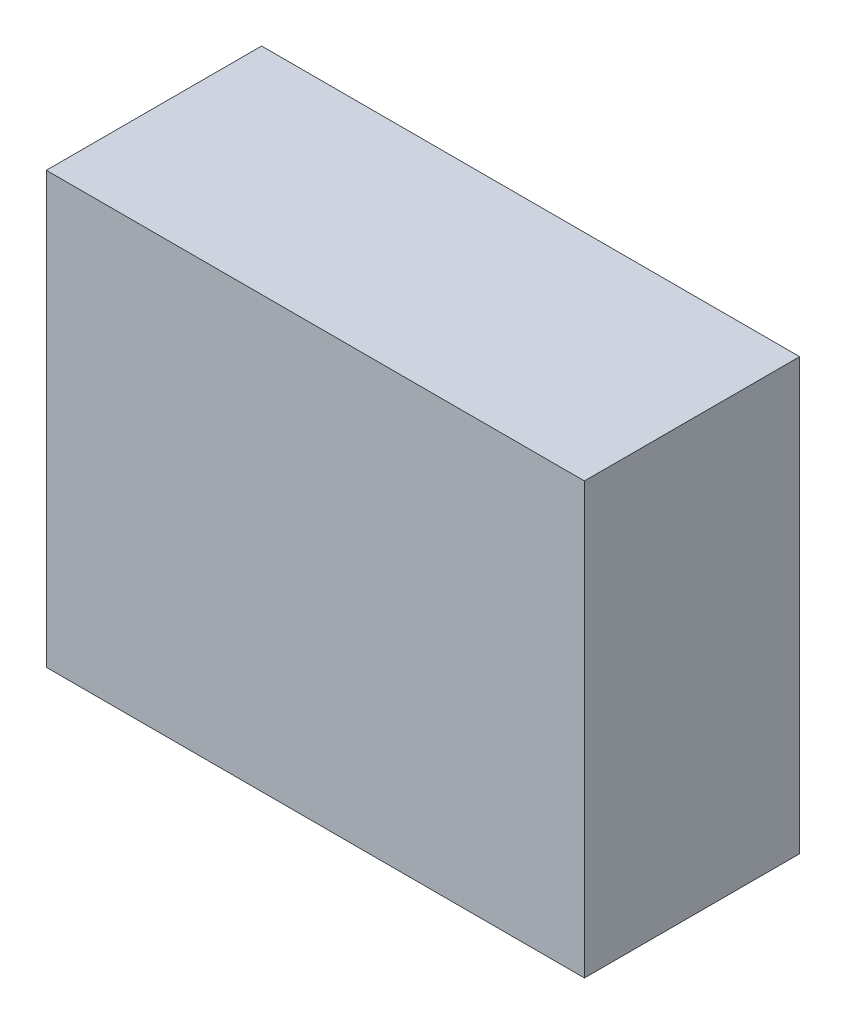
ISO-10303-21;
HEADER;
FILE_DESCRIPTION(('STEP AP214'),'2;1');
FILE_NAME('part.step','',(''),(''),'','','');
FILE_SCHEMA(('AUTOMOTIVE_DESIGN { 1 0 10303 214 1 1 1 1 }'));
ENDSEC;
DATA;
#1=APPLICATION_CONTEXT('core data for automotive mechanical design processes');
#2=APPLICATION_PROTOCOL_DEFINITION('international standard','automotive_design',2000,#1);
#3=PRODUCT_CONTEXT('',#1,'mechanical');
#4=PRODUCT('Part','Part','',(#3));
#5=PRODUCT_RELATED_PRODUCT_CATEGORY('part','',(#4));
#6=PRODUCT_DEFINITION_FORMATION('','',#4);
#7=PRODUCT_DEFINITION_CONTEXT('part definition',#1,'design');
#8=PRODUCT_DEFINITION('design','',#6,#7);
#9=PRODUCT_DEFINITION_SHAPE('','',#8);
#10=(LENGTH_UNIT() NAMED_UNIT(*) SI_UNIT(.MILLI.,.METRE.));
#11=(NAMED_UNIT(*) PLANE_ANGLE_UNIT() SI_UNIT($,.RADIAN.));
#12=(NAMED_UNIT(*) SI_UNIT($,.STERADIAN.) SOLID_ANGLE_UNIT());
#13=UNCERTAINTY_MEASURE_WITH_UNIT(LENGTH_MEASURE(1.E-05),#10,'distance_accuracy_value','');
#14=(GEOMETRIC_REPRESENTATION_CONTEXT(3) GLOBAL_UNCERTAINTY_ASSIGNED_CONTEXT((#13)) GLOBAL_UNIT_ASSIGNED_CONTEXT((#10,
#11,#12)) REPRESENTATION_CONTEXT('',''));
#15=CARTESIAN_POINT('',(0.,0.,0.));
#16=DIRECTION('',(0.,0.,1.));
#17=DIRECTION('',(1.,0.,0.));
#18=AXIS2_PLACEMENT_3D('',#15,#16,#17);
#19=CARTESIAN_POINT('',(25.,40.,10.));
#20=DIRECTION('',(-1.,0.,0.));
#21=DIRECTION('',(0.,0.,1.));
#22=AXIS2_PLACEMENT_3D('',#19,#20,#21);
#23=PLANE('',#22);
#24=DIRECTION('',(0.,0.,-1.));
#25=VECTOR('',#24,1.);
#26=CARTESIAN_POINT('',(25.,0.,10.));
#27=LINE('',#26,#25);
#28=CARTESIAN_POINT('',(25.,0.,10.));
#29=VERTEX_POINT('',#28);
#30=CARTESIAN_POINT('',(25.,0.,-10.));
#31=VERTEX_POINT('',#30);
#32=EDGE_CURVE('E99',#29,#31,#27,.T.);
#33=ORIENTED_EDGE('',*,*,#32,.T.);
#34=DIRECTION('',(0.,-1.,0.));
#35=VECTOR('',#34,1.);
#36=CARTESIAN_POINT('',(25.,40.,-10.));
#37=LINE('',#36,#35);
#38=CARTESIAN_POINT('',(25.,40.,-10.));
#39=VERTEX_POINT('',#38);
#40=EDGE_CURVE('E11',#39,#31,#37,.T.);
#41=ORIENTED_EDGE('',*,*,#40,.F.);
#42=DIRECTION('',(0.,0.,-1.));
#43=VECTOR('',#42,1.);
#44=CARTESIAN_POINT('',(25.,40.,10.));
#45=LINE('',#44,#43);
#46=CARTESIAN_POINT('',(25.,40.,10.));
#47=VERTEX_POINT('',#46);
#48=EDGE_CURVE('E87',#47,#39,#45,.T.);
#49=ORIENTED_EDGE('',*,*,#48,.F.);
#50=DIRECTION('',(0.,-1.,0.));
#51=VECTOR('',#50,1.);
#52=CARTESIAN_POINT('',(25.,40.,10.));
#53=LINE('',#52,#51);
#54=EDGE_CURVE('E95',#47,#29,#53,.T.);
#55=ORIENTED_EDGE('',*,*,#54,.T.);
#56=EDGE_LOOP('',(#33,#41,#49,#55));
#57=FACE_BOUND('',#56,.T.);
#58=ADVANCED_FACE('F36',(#57),#23,.F.);
#59=CARTESIAN_POINT('',(-25.,40.,-10.));
#60=DIRECTION('',(0.,0.,1.));
#61=DIRECTION('',(1.,0.,0.));
#62=AXIS2_PLACEMENT_3D('',#59,#60,#61);
#63=PLANE('',#62);
#64=DIRECTION('',(-1.,0.,0.));
#65=VECTOR('',#64,1.);
#66=CARTESIAN_POINT('',(-25.,0.,-10.));
#67=LINE('',#66,#65);
#68=CARTESIAN_POINT('',(-25.,0.,-10.));
#69=VERTEX_POINT('',#68);
#70=EDGE_CURVE('E91',#31,#69,#67,.T.);
#71=ORIENTED_EDGE('',*,*,#70,.T.);
#72=DIRECTION('',(0.,-1.,0.));
#73=VECTOR('',#72,1.);
#74=CARTESIAN_POINT('',(-25.,40.,-10.));
#75=LINE('',#74,#73);
#76=CARTESIAN_POINT('',(-25.,40.,-10.));
#77=VERTEX_POINT('',#76);
#78=EDGE_CURVE('E44',#77,#69,#75,.T.);
#79=ORIENTED_EDGE('',*,*,#78,.F.);
#80=DIRECTION('',(-1.,0.,0.));
#81=VECTOR('',#80,1.);
#82=CARTESIAN_POINT('',(-25.,40.,-10.));
#83=LINE('',#82,#81);
#84=EDGE_CURVE('E82',#39,#77,#83,.T.);
#85=ORIENTED_EDGE('',*,*,#84,.F.);
#86=ORIENTED_EDGE('',*,*,#40,.T.);
#87=EDGE_LOOP('',(#71,#79,#85,#86));
#88=FACE_BOUND('',#87,.T.);
#89=ADVANCED_FACE('F90',(#88),#63,.F.);
#90=CARTESIAN_POINT('',(-25.,40.,10.));
#91=DIRECTION('',(1.,0.,0.));
#92=DIRECTION('',(0.,0.,-1.));
#93=AXIS2_PLACEMENT_3D('',#90,#91,#92);
#94=PLANE('',#93);
#95=DIRECTION('',(0.,0.,1.));
#96=VECTOR('',#95,1.);
#97=CARTESIAN_POINT('',(-25.,0.,10.));
#98=LINE('',#97,#96);
#99=CARTESIAN_POINT('',(-25.,0.,10.));
#100=VERTEX_POINT('',#99);
#101=EDGE_CURVE('E69',#69,#100,#98,.T.);
#102=ORIENTED_EDGE('',*,*,#101,.T.);
#103=DIRECTION('',(0.,-1.,0.));
#104=VECTOR('',#103,1.);
#105=CARTESIAN_POINT('',(-25.,40.,10.));
#106=LINE('',#105,#104);
#107=CARTESIAN_POINT('',(-25.,40.,10.));
#108=VERTEX_POINT('',#107);
#109=EDGE_CURVE('E92',#108,#100,#106,.T.);
#110=ORIENTED_EDGE('',*,*,#109,.F.);
#111=DIRECTION('',(0.,0.,1.));
#112=VECTOR('',#111,1.);
#113=CARTESIAN_POINT('',(-25.,40.,10.));
#114=LINE('',#113,#112);
#115=EDGE_CURVE('E85',#77,#108,#114,.T.);
#116=ORIENTED_EDGE('',*,*,#115,.F.);
#117=ORIENTED_EDGE('',*,*,#78,.T.);
#118=EDGE_LOOP('',(#102,#110,#116,#117));
#119=FACE_BOUND('',#118,.T.);
#120=ADVANCED_FACE('F93',(#119),#94,.F.);
#121=CARTESIAN_POINT('',(-25.,40.,10.));
#122=DIRECTION('',(0.,0.,-1.));
#123=DIRECTION('',(-1.,0.,0.));
#124=AXIS2_PLACEMENT_3D('',#121,#122,#123);
#125=PLANE('',#124);
#126=DIRECTION('',(1.,0.,0.));
#127=VECTOR('',#126,1.);
#128=CARTESIAN_POINT('',(-25.,0.,10.));
#129=LINE('',#128,#127);
#130=EDGE_CURVE('E75',#100,#29,#129,.T.);
#131=ORIENTED_EDGE('',*,*,#130,.T.);
#132=ORIENTED_EDGE('',*,*,#54,.F.);
#133=DIRECTION('',(1.,0.,0.));
#134=VECTOR('',#133,1.);
#135=CARTESIAN_POINT('',(-25.,40.,10.));
#136=LINE('',#135,#134);
#137=EDGE_CURVE('E52',#108,#47,#136,.T.);
#138=ORIENTED_EDGE('',*,*,#137,.F.);
#139=ORIENTED_EDGE('',*,*,#109,.T.);
#140=EDGE_LOOP('',(#131,#132,#138,#139));
#141=FACE_BOUND('',#140,.T.);
#142=ADVANCED_FACE('F106',(#141),#125,.F.);
#143=CARTESIAN_POINT('',(0.,40.,0.));
#144=DIRECTION('',(0.,-1.,0.));
#145=DIRECTION('',(0.,0.,-1.));
#146=AXIS2_PLACEMENT_3D('',#143,#144,#145);
#147=PLANE('',#146);
#148=ORIENTED_EDGE('',*,*,#48,.T.);
#149=ORIENTED_EDGE('',*,*,#84,.T.);
#150=ORIENTED_EDGE('',*,*,#115,.T.);
#151=ORIENTED_EDGE('',*,*,#137,.T.);
#152=EDGE_LOOP('',(#148,#149,#150,#151));
#153=FACE_BOUND('',#152,.T.);
#154=ADVANCED_FACE('F83',(#153),#147,.F.);
#155=CARTESIAN_POINT('',(0.,0.,0.));
#156=DIRECTION('',(0.,-1.,0.));
#157=DIRECTION('',(0.,0.,-1.));
#158=AXIS2_PLACEMENT_3D('',#155,#156,#157);
#159=PLANE('',#158);
#160=ORIENTED_EDGE('',*,*,#32,.F.);
#161=ORIENTED_EDGE('',*,*,#130,.F.);
#162=ORIENTED_EDGE('',*,*,#101,.F.);
#163=ORIENTED_EDGE('',*,*,#70,.F.);
#164=EDGE_LOOP('',(#160,#161,#162,#163));
#165=FACE_BOUND('',#164,.T.);
#166=ADVANCED_FACE('F109',(#165),#159,.T.);
#167=CLOSED_SHELL('',(#58,#89,#120,#142,#154,#166));
#168=MANIFOLD_SOLID_BREP('B2',#167);
#169=ADVANCED_BREP_SHAPE_REPRESENTATION('',(#18,#168),#14);
#170=SHAPE_DEFINITION_REPRESENTATION(#9,#169);
ENDSEC;
END-ISO-10303-21;
